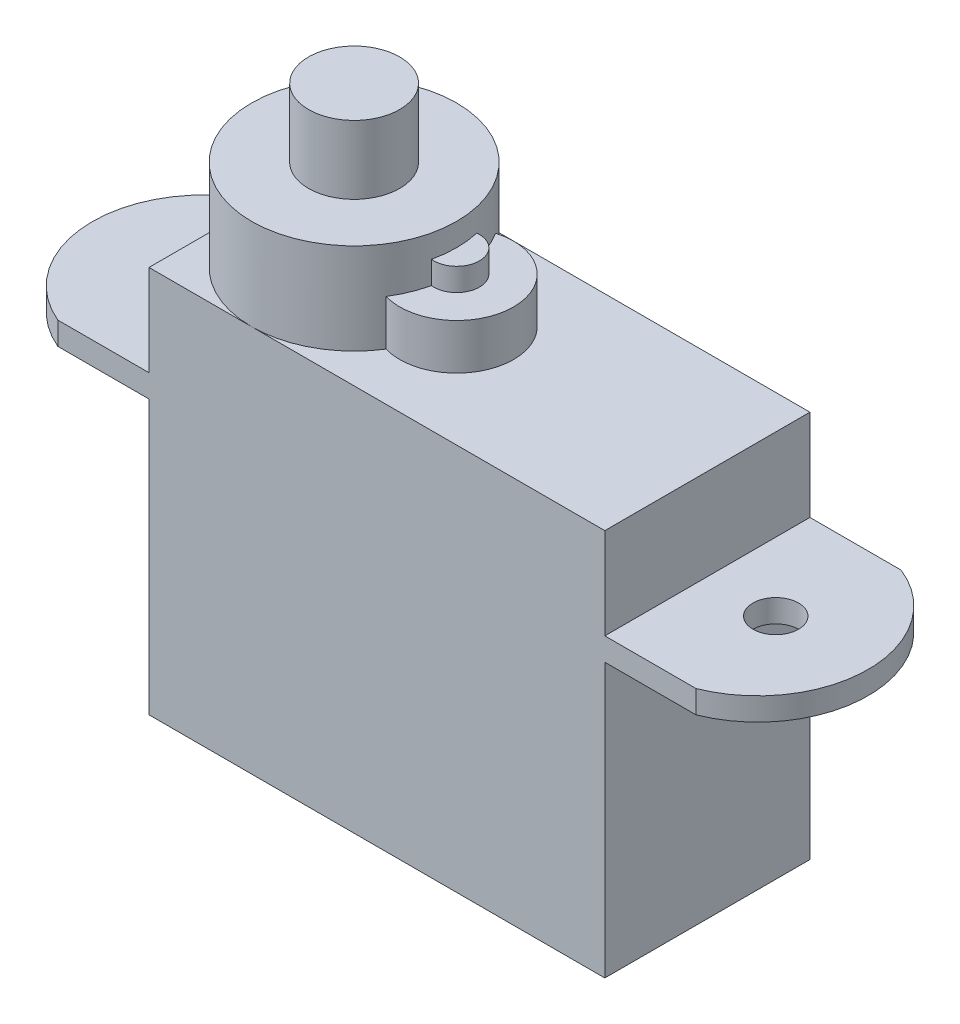
ISO-10303-21;
HEADER;
FILE_DESCRIPTION(('STEP AP214'),'2;1');
FILE_NAME('part.step','',(''),(''),'','','');
FILE_SCHEMA(('AUTOMOTIVE_DESIGN { 1 0 10303 214 1 1 1 1 }'));
ENDSEC;
DATA;
#1=APPLICATION_CONTEXT('core data for automotive mechanical design processes');
#2=APPLICATION_PROTOCOL_DEFINITION('international standard','automotive_design',2000,#1);
#3=PRODUCT_CONTEXT('',#1,'mechanical');
#4=PRODUCT('Part','Part','',(#3));
#5=PRODUCT_RELATED_PRODUCT_CATEGORY('part','',(#4));
#6=PRODUCT_DEFINITION_FORMATION('','',#4);
#7=PRODUCT_DEFINITION_CONTEXT('part definition',#1,'design');
#8=PRODUCT_DEFINITION('design','',#6,#7);
#9=PRODUCT_DEFINITION_SHAPE('','',#8);
#10=(LENGTH_UNIT() NAMED_UNIT(*) SI_UNIT(.MILLI.,.METRE.));
#11=(NAMED_UNIT(*) PLANE_ANGLE_UNIT() SI_UNIT($,.RADIAN.));
#12=(NAMED_UNIT(*) SI_UNIT($,.STERADIAN.) SOLID_ANGLE_UNIT());
#13=UNCERTAINTY_MEASURE_WITH_UNIT(LENGTH_MEASURE(1.E-05),#10,'distance_accuracy_value','');
#14=(GEOMETRIC_REPRESENTATION_CONTEXT(3) GLOBAL_UNCERTAINTY_ASSIGNED_CONTEXT((#13)) GLOBAL_UNIT_ASSIGNED_CONTEXT((#10,
#11,#12)) REPRESENTATION_CONTEXT('',''));
#15=CARTESIAN_POINT('',(0.,0.,0.));
#16=DIRECTION('',(0.,0.,1.));
#17=DIRECTION('',(1.,0.,0.));
#18=AXIS2_PLACEMENT_3D('',#15,#16,#17);
#19=CARTESIAN_POINT('',(-5.5,8.,0.));
#20=DIRECTION('',(0.,-1.,0.));
#21=DIRECTION('',(0.,0.,-1.));
#22=AXIS2_PLACEMENT_3D('',#19,#20,#21);
#23=CYLINDRICAL_SURFACE('',#22,4.5);
#24=CARTESIAN_POINT('',(-5.5,8.,0.));
#25=DIRECTION('',(0.,1.,0.));
#26=DIRECTION('',(0.,0.,1.));
#27=AXIS2_PLACEMENT_3D('',#24,#25,#26);
#28=CIRCLE('',#27,4.5);
#29=CARTESIAN_POINT('',(-5.5,8.,4.5));
#30=VERTEX_POINT('',#29);
#31=EDGE_CURVE('E249',#30,#30,#28,.T.);
#32=ORIENTED_EDGE('',*,*,#31,.F.);
#33=EDGE_LOOP('',(#32));
#34=FACE_BOUND('',#33,.T.);
#35=DIRECTION('',(0.,-1.,0.));
#36=VECTOR('',#35,1.);
#37=CARTESIAN_POINT('',(-1.69444444444444,3.,2.40161339802647));
#38=LINE('',#37,#36);
#39=CARTESIAN_POINT('',(-1.69444444444444,6.,2.40161339802647));
#40=VERTEX_POINT('',#39);
#41=CARTESIAN_POINT('',(-1.69444444444444,4.,2.40161339802647));
#42=VERTEX_POINT('',#41);
#43=EDGE_CURVE('E11',#40,#42,#38,.T.);
#44=ORIENTED_EDGE('',*,*,#43,.F.);
#45=CARTESIAN_POINT('',(-5.5,6.,0.));
#46=DIRECTION('',(0.,1.,0.));
#47=DIRECTION('',(0.,0.,1.));
#48=AXIS2_PLACEMENT_3D('',#45,#46,#47);
#49=CIRCLE('',#48,4.5);
#50=CARTESIAN_POINT('',(-1.11111111111111,6.,0.993807989999906));
#51=VERTEX_POINT('',#50);
#52=EDGE_CURVE('E42',#40,#51,#49,.T.);
#53=ORIENTED_EDGE('',*,*,#52,.T.);
#54=DIRECTION('',(0.,-1.,0.));
#55=VECTOR('',#54,1.);
#56=CARTESIAN_POINT('',(-1.11111111111111,4.,0.993807989999906));
#57=LINE('',#56,#55);
#58=CARTESIAN_POINT('',(-1.11111111111111,7.,0.993807989999906));
#59=VERTEX_POINT('',#58);
#60=EDGE_CURVE('E57',#51,#59,#57,.F.);
#61=ORIENTED_EDGE('',*,*,#60,.T.);
#62=CARTESIAN_POINT('',(-5.5,7.,0.));
#63=DIRECTION('',(0.,1.,0.));
#64=DIRECTION('',(0.,0.,1.));
#65=AXIS2_PLACEMENT_3D('',#62,#63,#64);
#66=CIRCLE('',#65,4.5);
#67=CARTESIAN_POINT('',(-1.11111111111111,7.,-0.993807989999906));
#68=VERTEX_POINT('',#67);
#69=EDGE_CURVE('E233',#68,#59,#66,.F.);
#70=ORIENTED_EDGE('',*,*,#69,.F.);
#71=DIRECTION('',(0.,-1.,0.));
#72=VECTOR('',#71,1.);
#73=CARTESIAN_POINT('',(-1.11111111111111,4.,-0.993807989999906));
#74=LINE('',#73,#72);
#75=CARTESIAN_POINT('',(-1.11111111111111,6.,-0.993807989999906));
#76=VERTEX_POINT('',#75);
#77=EDGE_CURVE('E174',#68,#76,#74,.T.);
#78=ORIENTED_EDGE('',*,*,#77,.T.);
#79=CARTESIAN_POINT('',(-1.69444444444444,6.,-2.40161339802647));
#80=VERTEX_POINT('',#79);
#81=EDGE_CURVE('E159',#76,#80,#49,.T.);
#82=ORIENTED_EDGE('',*,*,#81,.T.);
#83=DIRECTION('',(0.,-1.,0.));
#84=VECTOR('',#83,1.);
#85=CARTESIAN_POINT('',(-1.69444444444444,3.,-2.40161339802647));
#86=LINE('',#85,#84);
#87=CARTESIAN_POINT('',(-1.69444444444444,4.,-2.40161339802647));
#88=VERTEX_POINT('',#87);
#89=EDGE_CURVE('E157',#88,#80,#86,.F.);
#90=ORIENTED_EDGE('',*,*,#89,.F.);
#91=CARTESIAN_POINT('',(-5.5,4.,0.));
#92=DIRECTION('',(0.,1.,0.));
#93=DIRECTION('',(0.,0.,1.));
#94=AXIS2_PLACEMENT_3D('',#91,#92,#93);
#95=CIRCLE('',#94,4.5);
#96=CARTESIAN_POINT('',(-5.5,4.,-4.5));
#97=VERTEX_POINT('',#96);
#98=EDGE_CURVE('E173',#97,#88,#95,.F.);
#99=ORIENTED_EDGE('',*,*,#98,.F.);
#100=CARTESIAN_POINT('',(-10.,4.,0.));
#101=VERTEX_POINT('',#100);
#102=EDGE_CURVE('E177',#101,#97,#95,.F.);
#103=ORIENTED_EDGE('',*,*,#102,.F.);
#104=CARTESIAN_POINT('',(-5.5,4.,4.5));
#105=VERTEX_POINT('',#104);
#106=EDGE_CURVE('E170',#105,#101,#95,.F.);
#107=ORIENTED_EDGE('',*,*,#106,.F.);
#108=EDGE_CURVE('E168',#42,#105,#95,.F.);
#109=ORIENTED_EDGE('',*,*,#108,.F.);
#110=EDGE_LOOP('',(#44,#53,#61,#70,#78,#82,#90,#99,#103,#107,#109));
#111=FACE_BOUND('',#110,.T.);
#112=ADVANCED_FACE('F34',(#34,#111),#23,.T.);
#113=CARTESIAN_POINT('',(0.,4.,0.));
#114=DIRECTION('',(0.,1.,0.));
#115=DIRECTION('',(0.,0.,1.));
#116=AXIS2_PLACEMENT_3D('',#113,#114,#115);
#117=PLANE('',#116);
#118=ORIENTED_EDGE('',*,*,#98,.T.);
#119=CARTESIAN_POINT('',(-0.999999999999999,4.,0.));
#120=DIRECTION('',(0.,1.,0.));
#121=DIRECTION('',(0.,0.,1.));
#122=AXIS2_PLACEMENT_3D('',#119,#120,#121);
#123=CIRCLE('',#122,2.5);
#124=EDGE_CURVE('E255',#88,#42,#123,.F.);
#125=ORIENTED_EDGE('',*,*,#124,.T.);
#126=ORIENTED_EDGE('',*,*,#108,.T.);
#127=DIRECTION('',(1.,0.,0.));
#128=VECTOR('',#127,1.);
#129=CARTESIAN_POINT('',(0.,4.,4.5));
#130=LINE('',#129,#128);
#131=CARTESIAN_POINT('',(10.,4.,4.5));
#132=VERTEX_POINT('',#131);
#133=EDGE_CURVE('E217',#105,#132,#130,.T.);
#134=ORIENTED_EDGE('',*,*,#133,.T.);
#135=DIRECTION('',(0.,0.,-1.));
#136=VECTOR('',#135,1.);
#137=CARTESIAN_POINT('',(10.,4.,0.));
#138=LINE('',#137,#136);
#139=CARTESIAN_POINT('',(10.,4.,-4.5));
#140=VERTEX_POINT('',#139);
#141=EDGE_CURVE('E201',#132,#140,#138,.T.);
#142=ORIENTED_EDGE('',*,*,#141,.T.);
#143=DIRECTION('',(1.,0.,0.));
#144=VECTOR('',#143,1.);
#145=CARTESIAN_POINT('',(0.,4.,-4.5));
#146=LINE('',#145,#144);
#147=EDGE_CURVE('E198',#97,#140,#146,.T.);
#148=ORIENTED_EDGE('',*,*,#147,.F.);
#149=EDGE_LOOP('',(#118,#125,#126,#134,#142,#148));
#150=FACE_BOUND('',#149,.T.);
#151=ADVANCED_FACE('F199',(#150),#117,.T.);
#152=DIRECTION('',(0.,0.,-1.));
#153=VECTOR('',#152,1.);
#154=CARTESIAN_POINT('',(-10.,4.,0.));
#155=LINE('',#154,#153);
#156=CARTESIAN_POINT('',(-10.,4.,-4.5));
#157=VERTEX_POINT('',#156);
#158=EDGE_CURVE('E195',#101,#157,#155,.T.);
#159=ORIENTED_EDGE('',*,*,#158,.F.);
#160=ORIENTED_EDGE('',*,*,#102,.T.);
#161=EDGE_CURVE('E194',#157,#97,#146,.T.);
#162=ORIENTED_EDGE('',*,*,#161,.F.);
#163=EDGE_LOOP('',(#159,#160,#162));
#164=FACE_BOUND('',#163,.T.);
#165=ADVANCED_FACE('F192',(#164),#117,.T.);
#166=CARTESIAN_POINT('',(-0.999999999999999,7.,0.));
#167=DIRECTION('',(0.,-1.,0.));
#168=DIRECTION('',(0.,0.,-1.));
#169=AXIS2_PLACEMENT_3D('',#166,#167,#168);
#170=CYLINDRICAL_SURFACE('',#169,0.999999999999999);
#171=ORIENTED_EDGE('',*,*,#60,.F.);
#172=CARTESIAN_POINT('',(-0.999999999999999,6.,0.));
#173=DIRECTION('',(0.,1.,0.));
#174=DIRECTION('',(0.,0.,1.));
#175=AXIS2_PLACEMENT_3D('',#172,#173,#174);
#176=CIRCLE('',#175,0.999999999999999);
#177=EDGE_CURVE('E155',#51,#76,#176,.T.);
#178=ORIENTED_EDGE('',*,*,#177,.T.);
#179=ORIENTED_EDGE('',*,*,#77,.F.);
#180=CARTESIAN_POINT('',(-0.999999999999999,7.,0.));
#181=DIRECTION('',(0.,1.,0.));
#182=DIRECTION('',(0.,0.,1.));
#183=AXIS2_PLACEMENT_3D('',#180,#181,#182);
#184=CIRCLE('',#183,0.999999999999999);
#185=EDGE_CURVE('E187',#59,#68,#184,.T.);
#186=ORIENTED_EDGE('',*,*,#185,.F.);
#187=EDGE_LOOP('',(#171,#178,#179,#186));
#188=FACE_BOUND('',#187,.T.);
#189=ADVANCED_FACE('F252',(#188),#170,.T.);
#190=CARTESIAN_POINT('',(-10.,-13.,0.));
#191=DIRECTION('',(1.,0.,0.));
#192=DIRECTION('',(0.,0.,-1.));
#193=AXIS2_PLACEMENT_3D('',#190,#191,#192);
#194=PLANE('',#193);
#195=DIRECTION('',(0.,1.,0.));
#196=VECTOR('',#195,1.);
#197=CARTESIAN_POINT('',(-10.,-13.,-4.5));
#198=LINE('',#197,#196);
#199=CARTESIAN_POINT('',(-10.,0.0001,-4.5));
#200=VERTEX_POINT('',#199);
#201=EDGE_CURVE('E210',#200,#157,#198,.T.);
#202=ORIENTED_EDGE('',*,*,#201,.F.);
#203=DIRECTION('',(0.,0.,-1.));
#204=VECTOR('',#203,1.);
#205=CARTESIAN_POINT('',(-10.,0.0001,0.));
#206=LINE('',#205,#204);
#207=CARTESIAN_POINT('',(-10.,0.0001,4.5));
#208=VERTEX_POINT('',#207);
#209=EDGE_CURVE('E347',#208,#200,#206,.T.);
#210=ORIENTED_EDGE('',*,*,#209,.F.);
#211=DIRECTION('',(0.,1.,0.));
#212=VECTOR('',#211,1.);
#213=CARTESIAN_POINT('',(-10.,-13.,4.5));
#214=LINE('',#213,#212);
#215=CARTESIAN_POINT('',(-10.,4.,4.5));
#216=VERTEX_POINT('',#215);
#217=EDGE_CURVE('E242',#208,#216,#214,.T.);
#218=ORIENTED_EDGE('',*,*,#217,.T.);
#219=EDGE_CURVE('E211',#216,#101,#155,.T.);
#220=ORIENTED_EDGE('',*,*,#219,.T.);
#221=ORIENTED_EDGE('',*,*,#158,.T.);
#222=EDGE_LOOP('',(#202,#210,#218,#220,#221));
#223=FACE_BOUND('',#222,.T.);
#224=ADVANCED_FACE('F290',(#223),#194,.F.);
#225=CARTESIAN_POINT('',(10.,-13.,0.));
#226=DIRECTION('',(1.,0.,0.));
#227=DIRECTION('',(0.,0.,-1.));
#228=AXIS2_PLACEMENT_3D('',#225,#226,#227);
#229=PLANE('',#228);
#230=DIRECTION('',(0.,1.,0.));
#231=VECTOR('',#230,1.);
#232=CARTESIAN_POINT('',(10.,-13.,4.5));
#233=LINE('',#232,#231);
#234=CARTESIAN_POINT('',(10.,9.99999999994061E-05,4.5));
#235=VERTEX_POINT('',#234);
#236=EDGE_CURVE('E238',#235,#132,#233,.T.);
#237=ORIENTED_EDGE('',*,*,#236,.F.);
#238=DIRECTION('',(0.,0.,-1.));
#239=VECTOR('',#238,1.);
#240=CARTESIAN_POINT('',(10.,0.0001,0.));
#241=LINE('',#240,#239);
#242=CARTESIAN_POINT('',(10.,9.99999999994061E-05,-4.5));
#243=VERTEX_POINT('',#242);
#244=EDGE_CURVE('E356',#235,#243,#241,.T.);
#245=ORIENTED_EDGE('',*,*,#244,.T.);
#246=DIRECTION('',(0.,1.,0.));
#247=VECTOR('',#246,1.);
#248=CARTESIAN_POINT('',(10.,-13.,-4.5));
#249=LINE('',#248,#247);
#250=EDGE_CURVE('E234',#243,#140,#249,.T.);
#251=ORIENTED_EDGE('',*,*,#250,.T.);
#252=ORIENTED_EDGE('',*,*,#141,.F.);
#253=EDGE_LOOP('',(#237,#245,#251,#252));
#254=FACE_BOUND('',#253,.T.);
#255=ADVANCED_FACE('F333',(#254),#229,.T.);
#256=CARTESIAN_POINT('',(0.,-13.,-4.5));
#257=DIRECTION('',(0.,0.,1.));
#258=DIRECTION('',(1.,0.,0.));
#259=AXIS2_PLACEMENT_3D('',#256,#257,#258);
#260=PLANE('',#259);
#261=ORIENTED_EDGE('',*,*,#161,.T.);
#262=ORIENTED_EDGE('',*,*,#147,.T.);
#263=ORIENTED_EDGE('',*,*,#250,.F.);
#264=DIRECTION('',(1.,0.,0.));
#265=VECTOR('',#264,1.);
#266=CARTESIAN_POINT('',(0.,0.0001,-4.5));
#267=LINE('',#266,#265);
#268=CARTESIAN_POINT('',(14.,0.0001,-4.5));
#269=VERTEX_POINT('',#268);
#270=EDGE_CURVE('E360',#243,#269,#267,.T.);
#271=ORIENTED_EDGE('',*,*,#270,.T.);
#272=DIRECTION('',(0.,1.,0.));
#273=VECTOR('',#272,1.);
#274=CARTESIAN_POINT('',(14.,-0.999999999999997,-4.5));
#275=LINE('',#274,#273);
#276=CARTESIAN_POINT('',(14.,-0.999999999999997,-4.5));
#277=VERTEX_POINT('',#276);
#278=EDGE_CURVE('E205',#277,#269,#275,.T.);
#279=ORIENTED_EDGE('',*,*,#278,.F.);
#280=DIRECTION('',(1.,0.,0.));
#281=VECTOR('',#280,1.);
#282=CARTESIAN_POINT('',(0.,-0.999999999999997,-4.5));
#283=LINE('',#282,#281);
#284=CARTESIAN_POINT('',(10.,-0.999999999999997,-4.5));
#285=VERTEX_POINT('',#284);
#286=EDGE_CURVE('E378',#285,#277,#283,.T.);
#287=ORIENTED_EDGE('',*,*,#286,.F.);
#288=CARTESIAN_POINT('',(10.,-13.,-4.5));
#289=VERTEX_POINT('',#288);
#290=EDGE_CURVE('E231',#289,#285,#249,.T.);
#291=ORIENTED_EDGE('',*,*,#290,.F.);
#292=DIRECTION('',(1.,0.,0.));
#293=VECTOR('',#292,1.);
#294=CARTESIAN_POINT('',(0.,-13.,-4.5));
#295=LINE('',#294,#293);
#296=CARTESIAN_POINT('',(-10.,-13.,-4.5));
#297=VERTEX_POINT('',#296);
#298=EDGE_CURVE('E221',#297,#289,#295,.T.);
#299=ORIENTED_EDGE('',*,*,#298,.F.);
#300=CARTESIAN_POINT('',(-10.,-0.999999999999997,-4.5));
#301=VERTEX_POINT('',#300);
#302=EDGE_CURVE('E243',#297,#301,#198,.T.);
#303=ORIENTED_EDGE('',*,*,#302,.T.);
#304=DIRECTION('',(-1.,0.,0.));
#305=VECTOR('',#304,1.);
#306=CARTESIAN_POINT('',(0.,-0.999999999999997,-4.5));
#307=LINE('',#306,#305);
#308=CARTESIAN_POINT('',(-14.,-0.999999999999997,-4.5));
#309=VERTEX_POINT('',#308);
#310=EDGE_CURVE('E404',#301,#309,#307,.T.);
#311=ORIENTED_EDGE('',*,*,#310,.T.);
#312=DIRECTION('',(0.,1.,0.));
#313=VECTOR('',#312,1.);
#314=CARTESIAN_POINT('',(-14.,-0.999999999999997,-4.5));
#315=LINE('',#314,#313);
#316=CARTESIAN_POINT('',(-14.,0.0001,-4.5));
#317=VERTEX_POINT('',#316);
#318=EDGE_CURVE('E390',#309,#317,#315,.T.);
#319=ORIENTED_EDGE('',*,*,#318,.T.);
#320=DIRECTION('',(-1.,0.,0.));
#321=VECTOR('',#320,1.);
#322=CARTESIAN_POINT('',(0.,0.0001,-4.5));
#323=LINE('',#322,#321);
#324=EDGE_CURVE('E416',#200,#317,#323,.T.);
#325=ORIENTED_EDGE('',*,*,#324,.F.);
#326=ORIENTED_EDGE('',*,*,#201,.T.);
#327=EDGE_LOOP('',(#261,#262,#263,#271,#279,#287,#291,#299,#303,#311,#319,#325,#326));
#328=FACE_BOUND('',#327,.T.);
#329=ADVANCED_FACE('F36',(#328),#260,.F.);
#330=DIRECTION('',(0.,0.,-1.));
#331=VECTOR('',#330,1.);
#332=CARTESIAN_POINT('',(10.,-0.999999999999997,0.));
#333=LINE('',#332,#331);
#334=CARTESIAN_POINT('',(10.,-0.999999999999997,4.5));
#335=VERTEX_POINT('',#334);
#336=EDGE_CURVE('E381',#335,#285,#333,.T.);
#337=ORIENTED_EDGE('',*,*,#336,.F.);
#338=CARTESIAN_POINT('',(10.,-13.,4.5));
#339=VERTEX_POINT('',#338);
#340=EDGE_CURVE('E235',#339,#335,#233,.T.);
#341=ORIENTED_EDGE('',*,*,#340,.F.);
#342=DIRECTION('',(0.,0.,-1.));
#343=VECTOR('',#342,1.);
#344=CARTESIAN_POINT('',(10.,-13.,0.));
#345=LINE('',#344,#343);
#346=EDGE_CURVE('E228',#339,#289,#345,.T.);
#347=ORIENTED_EDGE('',*,*,#346,.T.);
#348=ORIENTED_EDGE('',*,*,#290,.T.);
#349=EDGE_LOOP('',(#337,#341,#347,#348));
#350=FACE_BOUND('',#349,.T.);
#351=ADVANCED_FACE('F328',(#350),#229,.T.);
#352=CARTESIAN_POINT('',(0.,-13.,4.5));
#353=DIRECTION('',(0.,0.,1.));
#354=DIRECTION('',(1.,0.,0.));
#355=AXIS2_PLACEMENT_3D('',#352,#353,#354);
#356=PLANE('',#355);
#357=ORIENTED_EDGE('',*,*,#133,.F.);
#358=EDGE_CURVE('E218',#216,#105,#130,.T.);
#359=ORIENTED_EDGE('',*,*,#358,.F.);
#360=ORIENTED_EDGE('',*,*,#217,.F.);
#361=DIRECTION('',(-1.,0.,0.));
#362=VECTOR('',#361,1.);
#363=CARTESIAN_POINT('',(0.,0.0001,4.49999999999999));
#364=LINE('',#363,#362);
#365=CARTESIAN_POINT('',(-14.,0.0001,4.5));
#366=VERTEX_POINT('',#365);
#367=EDGE_CURVE('E411',#208,#366,#364,.T.);
#368=ORIENTED_EDGE('',*,*,#367,.T.);
#369=DIRECTION('',(0.,1.,0.));
#370=VECTOR('',#369,1.);
#371=CARTESIAN_POINT('',(-14.,-0.999999999999997,4.5));
#372=LINE('',#371,#370);
#373=CARTESIAN_POINT('',(-14.,-0.999999999999997,4.5));
#374=VERTEX_POINT('',#373);
#375=EDGE_CURVE('E387',#374,#366,#372,.T.);
#376=ORIENTED_EDGE('',*,*,#375,.F.);
#377=DIRECTION('',(-1.,0.,0.));
#378=VECTOR('',#377,1.);
#379=CARTESIAN_POINT('',(0.,-0.999999999999997,4.49999999999999));
#380=LINE('',#379,#378);
#381=CARTESIAN_POINT('',(-10.,-0.999999999999997,4.5));
#382=VERTEX_POINT('',#381);
#383=EDGE_CURVE('E399',#382,#374,#380,.T.);
#384=ORIENTED_EDGE('',*,*,#383,.F.);
#385=CARTESIAN_POINT('',(-10.,-13.,4.5));
#386=VERTEX_POINT('',#385);
#387=EDGE_CURVE('E239',#386,#382,#214,.T.);
#388=ORIENTED_EDGE('',*,*,#387,.F.);
#389=DIRECTION('',(1.,0.,0.));
#390=VECTOR('',#389,1.);
#391=CARTESIAN_POINT('',(0.,-13.,4.5));
#392=LINE('',#391,#390);
#393=EDGE_CURVE('E225',#386,#339,#392,.T.);
#394=ORIENTED_EDGE('',*,*,#393,.T.);
#395=ORIENTED_EDGE('',*,*,#340,.T.);
#396=DIRECTION('',(1.,0.,0.));
#397=VECTOR('',#396,1.);
#398=CARTESIAN_POINT('',(0.,-0.999999999999997,4.5));
#399=LINE('',#398,#397);
#400=CARTESIAN_POINT('',(14.,-0.999999999999997,4.5));
#401=VERTEX_POINT('',#400);
#402=EDGE_CURVE('E373',#335,#401,#399,.T.);
#403=ORIENTED_EDGE('',*,*,#402,.T.);
#404=DIRECTION('',(0.,1.,0.));
#405=VECTOR('',#404,1.);
#406=CARTESIAN_POINT('',(14.,-0.999999999999997,4.5));
#407=LINE('',#406,#405);
#408=CARTESIAN_POINT('',(14.,0.0001,4.5));
#409=VERTEX_POINT('',#408);
#410=EDGE_CURVE('E214',#401,#409,#407,.T.);
#411=ORIENTED_EDGE('',*,*,#410,.T.);
#412=DIRECTION('',(1.,0.,0.));
#413=VECTOR('',#412,1.);
#414=CARTESIAN_POINT('',(0.,0.0001,4.5));
#415=LINE('',#414,#413);
#416=EDGE_CURVE('E354',#235,#409,#415,.T.);
#417=ORIENTED_EDGE('',*,*,#416,.F.);
#418=ORIENTED_EDGE('',*,*,#236,.T.);
#419=EDGE_LOOP('',(#357,#359,#360,#368,#376,#384,#388,#394,#395,#403,#411,#417,#418));
#420=FACE_BOUND('',#419,.T.);
#421=ADVANCED_FACE('F331',(#420),#356,.T.);
#422=ORIENTED_EDGE('',*,*,#387,.T.);
#423=DIRECTION('',(0.,0.,-1.));
#424=VECTOR('',#423,1.);
#425=CARTESIAN_POINT('',(-10.,-0.999999999999997,0.));
#426=LINE('',#425,#424);
#427=EDGE_CURVE('E396',#382,#301,#426,.T.);
#428=ORIENTED_EDGE('',*,*,#427,.T.);
#429=ORIENTED_EDGE('',*,*,#302,.F.);
#430=DIRECTION('',(0.,0.,-1.));
#431=VECTOR('',#430,1.);
#432=CARTESIAN_POINT('',(-10.,-13.,0.));
#433=LINE('',#432,#431);
#434=EDGE_CURVE('E223',#386,#297,#433,.T.);
#435=ORIENTED_EDGE('',*,*,#434,.F.);
#436=EDGE_LOOP('',(#422,#428,#429,#435));
#437=FACE_BOUND('',#436,.T.);
#438=ADVANCED_FACE('F326',(#437),#194,.F.);
#439=CARTESIAN_POINT('',(0.,-13.,0.));
#440=DIRECTION('',(0.,1.,0.));
#441=DIRECTION('',(0.,0.,1.));
#442=AXIS2_PLACEMENT_3D('',#439,#440,#441);
#443=PLANE('',#442);
#444=ORIENTED_EDGE('',*,*,#298,.T.);
#445=ORIENTED_EDGE('',*,*,#346,.F.);
#446=ORIENTED_EDGE('',*,*,#393,.F.);
#447=ORIENTED_EDGE('',*,*,#434,.T.);
#448=EDGE_LOOP('',(#444,#445,#446,#447));
#449=FACE_BOUND('',#448,.T.);
#450=ADVANCED_FACE('F323',(#449),#443,.F.);
#451=ORIENTED_EDGE('',*,*,#358,.T.);
#452=ORIENTED_EDGE('',*,*,#106,.T.);
#453=ORIENTED_EDGE('',*,*,#219,.F.);
#454=EDGE_LOOP('',(#451,#452,#453));
#455=FACE_BOUND('',#454,.T.);
#456=ADVANCED_FACE('F271',(#455),#117,.T.);
#457=CARTESIAN_POINT('',(13.,-0.999999999999997,0.));
#458=DIRECTION('',(0.,1.,0.));
#459=DIRECTION('',(0.,0.,1.));
#460=AXIS2_PLACEMENT_3D('',#457,#458,#459);
#461=CYLINDRICAL_SURFACE('',#460,1.);
#462=CARTESIAN_POINT('',(13.,-0.999999999999997,0.));
#463=DIRECTION('',(0.,1.,0.));
#464=DIRECTION('',(0.,0.,1.));
#465=AXIS2_PLACEMENT_3D('',#462,#463,#464);
#466=CIRCLE('',#465,1.);
#467=CARTESIAN_POINT('',(13.,-0.999999999999997,1.));
#468=VERTEX_POINT('',#467);
#469=EDGE_CURVE('E366',#468,#468,#466,.T.);
#470=ORIENTED_EDGE('',*,*,#469,.F.);
#471=EDGE_LOOP('',(#470));
#472=FACE_BOUND('',#471,.T.);
#473=CARTESIAN_POINT('',(13.,0.0001,0.));
#474=DIRECTION('',(0.,1.,0.));
#475=DIRECTION('',(0.,0.,1.));
#476=AXIS2_PLACEMENT_3D('',#473,#474,#475);
#477=CIRCLE('',#476,1.);
#478=CARTESIAN_POINT('',(13.,0.0001,1.));
#479=VERTEX_POINT('',#478);
#480=EDGE_CURVE('E385',#479,#479,#477,.T.);
#481=ORIENTED_EDGE('',*,*,#480,.T.);
#482=EDGE_LOOP('',(#481));
#483=FACE_BOUND('',#482,.T.);
#484=ADVANCED_FACE('F317',(#472,#483),#461,.F.);
#485=CARTESIAN_POINT('',(12.2119652884342,-0.999999999999997,0.));
#486=DIRECTION('',(0.,1.,0.));
#487=DIRECTION('',(0.,0.,1.));
#488=AXIS2_PLACEMENT_3D('',#485,#486,#487);
#489=CYLINDRICAL_SURFACE('',#488,4.84221727411773);
#490=ORIENTED_EDGE('',*,*,#278,.T.);
#491=CARTESIAN_POINT('',(12.2119652884342,0.0001,0.));
#492=DIRECTION('',(0.,1.,0.));
#493=DIRECTION('',(0.,0.,1.));
#494=AXIS2_PLACEMENT_3D('',#491,#492,#493);
#495=CIRCLE('',#494,4.84221727411773);
#496=EDGE_CURVE('E364',#269,#409,#495,.F.);
#497=ORIENTED_EDGE('',*,*,#496,.T.);
#498=ORIENTED_EDGE('',*,*,#410,.F.);
#499=CARTESIAN_POINT('',(12.2119652884342,-0.999999999999997,0.));
#500=DIRECTION('',(0.,1.,0.));
#501=DIRECTION('',(0.,0.,1.));
#502=AXIS2_PLACEMENT_3D('',#499,#500,#501);
#503=CIRCLE('',#502,4.84221727411773);
#504=EDGE_CURVE('E376',#277,#401,#503,.F.);
#505=ORIENTED_EDGE('',*,*,#504,.F.);
#506=EDGE_LOOP('',(#490,#497,#498,#505));
#507=FACE_BOUND('',#506,.T.);
#508=ADVANCED_FACE('F313',(#507),#489,.T.);
#509=CARTESIAN_POINT('',(0.,-0.999999999999997,0.));
#510=DIRECTION('',(0.,1.,0.));
#511=DIRECTION('',(0.,0.,1.));
#512=AXIS2_PLACEMENT_3D('',#509,#510,#511);
#513=PLANE('',#512);
#514=ORIENTED_EDGE('',*,*,#469,.T.);
#515=EDGE_LOOP('',(#514));
#516=FACE_BOUND('',#515,.T.);
#517=ORIENTED_EDGE('',*,*,#402,.F.);
#518=ORIENTED_EDGE('',*,*,#336,.T.);
#519=ORIENTED_EDGE('',*,*,#286,.T.);
#520=ORIENTED_EDGE('',*,*,#504,.T.);
#521=EDGE_LOOP('',(#517,#518,#519,#520));
#522=FACE_BOUND('',#521,.T.);
#523=ADVANCED_FACE('F309',(#516,#522),#513,.F.);
#524=CARTESIAN_POINT('',(0.,0.0001,0.));
#525=DIRECTION('',(0.,1.,0.));
#526=DIRECTION('',(0.,0.,1.));
#527=AXIS2_PLACEMENT_3D('',#524,#525,#526);
#528=PLANE('',#527);
#529=ORIENTED_EDGE('',*,*,#480,.F.);
#530=EDGE_LOOP('',(#529));
#531=FACE_BOUND('',#530,.T.);
#532=ORIENTED_EDGE('',*,*,#416,.T.);
#533=ORIENTED_EDGE('',*,*,#496,.F.);
#534=ORIENTED_EDGE('',*,*,#270,.F.);
#535=ORIENTED_EDGE('',*,*,#244,.F.);
#536=EDGE_LOOP('',(#532,#533,#534,#535));
#537=FACE_BOUND('',#536,.T.);
#538=ADVANCED_FACE('F305',(#531,#537),#528,.T.);
#539=CARTESIAN_POINT('',(-12.1018878522823,-0.999999999999997,0.));
#540=DIRECTION('',(0.,1.,0.));
#541=DIRECTION('',(0.,0.,1.));
#542=AXIS2_PLACEMENT_3D('',#539,#540,#541);
#543=CYLINDRICAL_SURFACE('',#542,4.88393588464401);
#544=ORIENTED_EDGE('',*,*,#375,.T.);
#545=CARTESIAN_POINT('',(-12.1018878522823,0.0001,0.));
#546=DIRECTION('',(0.,1.,0.));
#547=DIRECTION('',(0.,0.,1.));
#548=AXIS2_PLACEMENT_3D('',#545,#546,#547);
#549=CIRCLE('',#548,4.88393588464401);
#550=EDGE_CURVE('E413',#317,#366,#549,.T.);
#551=ORIENTED_EDGE('',*,*,#550,.F.);
#552=ORIENTED_EDGE('',*,*,#318,.F.);
#553=CARTESIAN_POINT('',(-12.1018878522823,-0.999999999999997,0.));
#554=DIRECTION('',(0.,1.,0.));
#555=DIRECTION('',(0.,0.,1.));
#556=AXIS2_PLACEMENT_3D('',#553,#554,#555);
#557=CIRCLE('',#556,4.88393588464401);
#558=EDGE_CURVE('E401',#309,#374,#557,.T.);
#559=ORIENTED_EDGE('',*,*,#558,.T.);
#560=EDGE_LOOP('',(#544,#551,#552,#559));
#561=FACE_BOUND('',#560,.T.);
#562=ADVANCED_FACE('F301',(#561),#543,.T.);
#563=CARTESIAN_POINT('',(-13.,-0.999999999999997,0.));
#564=DIRECTION('',(0.,1.,0.));
#565=DIRECTION('',(0.,0.,1.));
#566=AXIS2_PLACEMENT_3D('',#563,#564,#565);
#567=CYLINDRICAL_SURFACE('',#566,1.);
#568=CARTESIAN_POINT('',(-13.,-0.999999999999997,0.));
#569=DIRECTION('',(0.,1.,0.));
#570=DIRECTION('',(0.,0.,1.));
#571=AXIS2_PLACEMENT_3D('',#568,#569,#570);
#572=CIRCLE('',#571,1.);
#573=CARTESIAN_POINT('',(-13.,-0.999999999999997,1.));
#574=VERTEX_POINT('',#573);
#575=EDGE_CURVE('E392',#574,#574,#572,.T.);
#576=ORIENTED_EDGE('',*,*,#575,.F.);
#577=EDGE_LOOP('',(#576));
#578=FACE_BOUND('',#577,.T.);
#579=CARTESIAN_POINT('',(-13.,0.0001,0.));
#580=DIRECTION('',(0.,1.,0.));
#581=DIRECTION('',(0.,0.,1.));
#582=AXIS2_PLACEMENT_3D('',#579,#580,#581);
#583=CIRCLE('',#582,1.);
#584=CARTESIAN_POINT('',(-13.,0.0001,1.));
#585=VERTEX_POINT('',#584);
#586=EDGE_CURVE('E407',#585,#585,#583,.T.);
#587=ORIENTED_EDGE('',*,*,#586,.T.);
#588=EDGE_LOOP('',(#587));
#589=FACE_BOUND('',#588,.T.);
#590=ADVANCED_FACE('F297',(#578,#589),#567,.F.);
#591=CARTESIAN_POINT('',(0.,-0.999999999999997,0.));
#592=DIRECTION('',(0.,1.,0.));
#593=DIRECTION('',(0.,0.,1.));
#594=AXIS2_PLACEMENT_3D('',#591,#592,#593);
#595=PLANE('',#594);
#596=ORIENTED_EDGE('',*,*,#310,.F.);
#597=ORIENTED_EDGE('',*,*,#427,.F.);
#598=ORIENTED_EDGE('',*,*,#383,.T.);
#599=ORIENTED_EDGE('',*,*,#558,.F.);
#600=EDGE_LOOP('',(#596,#597,#598,#599));
#601=FACE_BOUND('',#600,.T.);
#602=ORIENTED_EDGE('',*,*,#575,.T.);
#603=EDGE_LOOP('',(#602));
#604=FACE_BOUND('',#603,.T.);
#605=ADVANCED_FACE('F293',(#601,#604),#595,.F.);
#606=CARTESIAN_POINT('',(0.,0.0001,0.));
#607=DIRECTION('',(0.,1.,0.));
#608=DIRECTION('',(0.,0.,1.));
#609=AXIS2_PLACEMENT_3D('',#606,#607,#608);
#610=PLANE('',#609);
#611=ORIENTED_EDGE('',*,*,#324,.T.);
#612=ORIENTED_EDGE('',*,*,#550,.T.);
#613=ORIENTED_EDGE('',*,*,#367,.F.);
#614=ORIENTED_EDGE('',*,*,#209,.T.);
#615=EDGE_LOOP('',(#611,#612,#613,#614));
#616=FACE_BOUND('',#615,.T.);
#617=ORIENTED_EDGE('',*,*,#586,.F.);
#618=EDGE_LOOP('',(#617));
#619=FACE_BOUND('',#618,.T.);
#620=ADVANCED_FACE('F286',(#616,#619),#610,.T.);
#621=CARTESIAN_POINT('',(0.,7.,0.));
#622=DIRECTION('',(0.,1.,0.));
#623=DIRECTION('',(0.,0.,1.));
#624=AXIS2_PLACEMENT_3D('',#621,#622,#623);
#625=PLANE('',#624);
#626=ORIENTED_EDGE('',*,*,#185,.T.);
#627=ORIENTED_EDGE('',*,*,#69,.T.);
#628=EDGE_LOOP('',(#626,#627));
#629=FACE_BOUND('',#628,.T.);
#630=ADVANCED_FACE('F283',(#629),#625,.T.);
#631=CARTESIAN_POINT('',(0.,8.,0.));
#632=DIRECTION('',(0.,1.,0.));
#633=DIRECTION('',(0.,0.,1.));
#634=AXIS2_PLACEMENT_3D('',#631,#632,#633);
#635=PLANE('',#634);
#636=CARTESIAN_POINT('',(-5.5,8.,0.));
#637=DIRECTION('',(0.,1.,0.));
#638=DIRECTION('',(0.,0.,1.));
#639=AXIS2_PLACEMENT_3D('',#636,#637,#638);
#640=CIRCLE('',#639,2.);
#641=CARTESIAN_POINT('',(-5.5,8.,2.));
#642=VERTEX_POINT('',#641);
#643=EDGE_CURVE('E246',#642,#642,#640,.T.);
#644=ORIENTED_EDGE('',*,*,#643,.F.);
#645=EDGE_LOOP('',(#644));
#646=FACE_BOUND('',#645,.T.);
#647=ORIENTED_EDGE('',*,*,#31,.T.);
#648=EDGE_LOOP('',(#647));
#649=FACE_BOUND('',#648,.T.);
#650=ADVANCED_FACE('F263',(#646,#649),#635,.T.);
#651=CARTESIAN_POINT('',(0.,11.,0.));
#652=DIRECTION('',(0.,1.,0.));
#653=DIRECTION('',(0.,0.,1.));
#654=AXIS2_PLACEMENT_3D('',#651,#652,#653);
#655=PLANE('',#654);
#656=CARTESIAN_POINT('',(-5.5,11.,0.));
#657=DIRECTION('',(0.,1.,0.));
#658=DIRECTION('',(0.,0.,1.));
#659=AXIS2_PLACEMENT_3D('',#656,#657,#658);
#660=CIRCLE('',#659,2.);
#661=CARTESIAN_POINT('',(-5.5,11.,2.));
#662=VERTEX_POINT('',#661);
#663=EDGE_CURVE('E181',#662,#662,#660,.T.);
#664=ORIENTED_EDGE('',*,*,#663,.T.);
#665=EDGE_LOOP('',(#664));
#666=FACE_BOUND('',#665,.T.);
#667=ADVANCED_FACE('F275',(#666),#655,.T.);
#668=CARTESIAN_POINT('',(-5.5,11.,0.));
#669=DIRECTION('',(0.,-1.,0.));
#670=DIRECTION('',(0.,0.,-1.));
#671=AXIS2_PLACEMENT_3D('',#668,#669,#670);
#672=CYLINDRICAL_SURFACE('',#671,2.);
#673=ORIENTED_EDGE('',*,*,#643,.T.);
#674=EDGE_LOOP('',(#673));
#675=FACE_BOUND('',#674,.T.);
#676=ORIENTED_EDGE('',*,*,#663,.F.);
#677=EDGE_LOOP('',(#676));
#678=FACE_BOUND('',#677,.T.);
#679=ADVANCED_FACE('F278',(#675,#678),#672,.T.);
#680=CARTESIAN_POINT('',(-0.999999999999999,6.,0.));
#681=DIRECTION('',(0.,-1.,0.));
#682=DIRECTION('',(0.,0.,-1.));
#683=AXIS2_PLACEMENT_3D('',#680,#681,#682);
#684=CYLINDRICAL_SURFACE('',#683,2.5);
#685=CARTESIAN_POINT('',(-0.999999999999999,6.,0.));
#686=DIRECTION('',(0.,1.,0.));
#687=DIRECTION('',(0.,0.,1.));
#688=AXIS2_PLACEMENT_3D('',#685,#686,#687);
#689=CIRCLE('',#688,2.5);
#690=EDGE_CURVE('E49',#40,#80,#689,.T.);
#691=ORIENTED_EDGE('',*,*,#690,.F.);
#692=ORIENTED_EDGE('',*,*,#43,.T.);
#693=ORIENTED_EDGE('',*,*,#124,.F.);
#694=ORIENTED_EDGE('',*,*,#89,.T.);
#695=EDGE_LOOP('',(#691,#692,#693,#694));
#696=FACE_BOUND('',#695,.T.);
#697=ADVANCED_FACE('F161',(#696),#684,.T.);
#698=CARTESIAN_POINT('',(0.,6.,0.));
#699=DIRECTION('',(0.,1.,0.));
#700=DIRECTION('',(0.,0.,1.));
#701=AXIS2_PLACEMENT_3D('',#698,#699,#700);
#702=PLANE('',#701);
#703=ORIENTED_EDGE('',*,*,#52,.F.);
#704=ORIENTED_EDGE('',*,*,#690,.T.);
#705=ORIENTED_EDGE('',*,*,#81,.F.);
#706=ORIENTED_EDGE('',*,*,#177,.F.);
#707=EDGE_LOOP('',(#703,#704,#705,#706));
#708=FACE_BOUND('',#707,.T.);
#709=ADVANCED_FACE('F153',(#708),#702,.T.);
#710=CLOSED_SHELL('',(#112,#151,#165,#189,#224,#255,#329,#351,#421,#438,#450,#456,#484,#508,
#523,#538,#562,#590,#605,#620,#630,#650,#667,#679,#697,#709));
#711=MANIFOLD_SOLID_BREP('B2',#710);
#712=ADVANCED_BREP_SHAPE_REPRESENTATION('',(#18,#711),#14);
#713=SHAPE_DEFINITION_REPRESENTATION(#9,#712);
ENDSEC;
END-ISO-10303-21;
